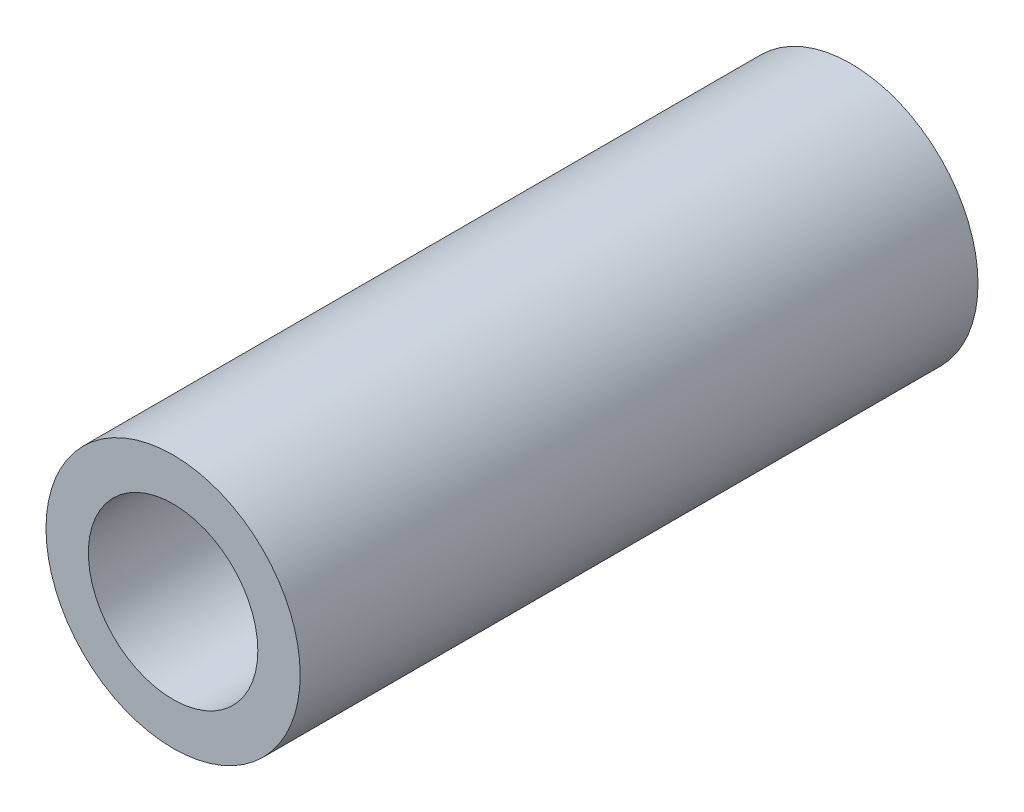
ISO-10303-21;
HEADER;
FILE_DESCRIPTION(('STEP AP214'),'2;1');
FILE_NAME('part.step','',(''),(''),'','','');
FILE_SCHEMA(('AUTOMOTIVE_DESIGN { 1 0 10303 214 1 1 1 1 }'));
ENDSEC;
DATA;
#1=APPLICATION_CONTEXT('core data for automotive mechanical design processes');
#2=APPLICATION_PROTOCOL_DEFINITION('international standard','automotive_design',2000,#1);
#3=PRODUCT_CONTEXT('',#1,'mechanical');
#4=PRODUCT('Part','Part','',(#3));
#5=PRODUCT_RELATED_PRODUCT_CATEGORY('part','',(#4));
#6=PRODUCT_DEFINITION_FORMATION('','',#4);
#7=PRODUCT_DEFINITION_CONTEXT('part definition',#1,'design');
#8=PRODUCT_DEFINITION('design','',#6,#7);
#9=PRODUCT_DEFINITION_SHAPE('','',#8);
#10=(LENGTH_UNIT() NAMED_UNIT(*) SI_UNIT(.MILLI.,.METRE.));
#11=(NAMED_UNIT(*) PLANE_ANGLE_UNIT() SI_UNIT($,.RADIAN.));
#12=(NAMED_UNIT(*) SI_UNIT($,.STERADIAN.) SOLID_ANGLE_UNIT());
#13=UNCERTAINTY_MEASURE_WITH_UNIT(LENGTH_MEASURE(1.E-05),#10,'distance_accuracy_value','');
#14=(GEOMETRIC_REPRESENTATION_CONTEXT(3) GLOBAL_UNCERTAINTY_ASSIGNED_CONTEXT((#13)) GLOBAL_UNIT_ASSIGNED_CONTEXT((#10,
#11,#12)) REPRESENTATION_CONTEXT('',''));
#15=CARTESIAN_POINT('',(0.,0.,0.));
#16=DIRECTION('',(0.,0.,1.));
#17=DIRECTION('',(1.,0.,0.));
#18=AXIS2_PLACEMENT_3D('',#15,#16,#17);
#19=CARTESIAN_POINT('',(0.,0.,40.));
#20=DIRECTION('',(0.,0.,-1.));
#21=DIRECTION('',(-1.,0.,0.));
#22=AXIS2_PLACEMENT_3D('',#19,#20,#21);
#23=CYLINDRICAL_SURFACE('',#22,7.5);
#24=CARTESIAN_POINT('',(0.,0.,40.));
#25=DIRECTION('',(0.,0.,1.));
#26=DIRECTION('',(1.,0.,0.));
#27=AXIS2_PLACEMENT_3D('',#24,#25,#26);
#28=CIRCLE('',#27,7.5);
#29=CARTESIAN_POINT('',(7.5,0.,40.));
#30=VERTEX_POINT('',#29);
#31=EDGE_CURVE('E10',#30,#30,#28,.T.);
#32=ORIENTED_EDGE('',*,*,#31,.F.);
#33=EDGE_LOOP('',(#32));
#34=FACE_BOUND('',#33,.T.);
#35=CARTESIAN_POINT('',(0.,0.,0.));
#36=DIRECTION('',(0.,0.,1.));
#37=DIRECTION('',(1.,0.,0.));
#38=AXIS2_PLACEMENT_3D('',#35,#36,#37);
#39=CIRCLE('',#38,7.5);
#40=CARTESIAN_POINT('',(7.5,0.,0.));
#41=VERTEX_POINT('',#40);
#42=EDGE_CURVE('E34',#41,#41,#39,.T.);
#43=ORIENTED_EDGE('',*,*,#42,.T.);
#44=EDGE_LOOP('',(#43));
#45=FACE_BOUND('',#44,.T.);
#46=ADVANCED_FACE('F31',(#34,#45),#23,.T.);
#47=CARTESIAN_POINT('',(0.,0.,40.));
#48=DIRECTION('',(0.,0.,1.));
#49=DIRECTION('',(1.,0.,0.));
#50=AXIS2_PLACEMENT_3D('',#47,#48,#49);
#51=PLANE('',#50);
#52=CARTESIAN_POINT('',(0.,0.,40.));
#53=DIRECTION('',(0.,0.,1.));
#54=DIRECTION('',(1.,0.,0.));
#55=AXIS2_PLACEMENT_3D('',#52,#53,#54);
#56=CIRCLE('',#55,5.);
#57=CARTESIAN_POINT('',(5.,0.,40.));
#58=VERTEX_POINT('',#57);
#59=EDGE_CURVE('E43',#58,#58,#56,.T.);
#60=ORIENTED_EDGE('',*,*,#59,.F.);
#61=EDGE_LOOP('',(#60));
#62=FACE_BOUND('',#61,.T.);
#63=ORIENTED_EDGE('',*,*,#31,.T.);
#64=EDGE_LOOP('',(#63));
#65=FACE_BOUND('',#64,.T.);
#66=ADVANCED_FACE('F68',(#62,#65),#51,.T.);
#67=CARTESIAN_POINT('',(0.,0.,0.));
#68=DIRECTION('',(0.,0.,1.));
#69=DIRECTION('',(1.,0.,0.));
#70=AXIS2_PLACEMENT_3D('',#67,#68,#69);
#71=PLANE('',#70);
#72=CARTESIAN_POINT('',(0.,0.,0.));
#73=DIRECTION('',(0.,0.,-1.));
#74=DIRECTION('',(-1.,0.,0.));
#75=AXIS2_PLACEMENT_3D('',#72,#73,#74);
#76=CIRCLE('',#75,5.);
#77=CARTESIAN_POINT('',(-5.,0.,0.));
#78=VERTEX_POINT('',#77);
#79=EDGE_CURVE('E49',#78,#78,#76,.T.);
#80=ORIENTED_EDGE('',*,*,#79,.F.);
#81=EDGE_LOOP('',(#80));
#82=FACE_BOUND('',#81,.T.);
#83=ORIENTED_EDGE('',*,*,#42,.F.);
#84=EDGE_LOOP('',(#83));
#85=FACE_BOUND('',#84,.T.);
#86=ADVANCED_FACE('F64',(#82,#85),#71,.F.);
#87=CARTESIAN_POINT('',(0.,0.,30.));
#88=DIRECTION('',(0.,0.,1.));
#89=DIRECTION('',(1.,0.,0.));
#90=AXIS2_PLACEMENT_3D('',#87,#88,#89);
#91=CYLINDRICAL_SURFACE('',#90,5.);
#92=CARTESIAN_POINT('',(0.,0.,30.));
#93=DIRECTION('',(0.,0.,1.));
#94=DIRECTION('',(1.,0.,0.));
#95=AXIS2_PLACEMENT_3D('',#92,#93,#94);
#96=CIRCLE('',#95,5.);
#97=CARTESIAN_POINT('',(5.,0.,30.));
#98=VERTEX_POINT('',#97);
#99=EDGE_CURVE('E41',#98,#98,#96,.T.);
#100=ORIENTED_EDGE('',*,*,#99,.F.);
#101=EDGE_LOOP('',(#100));
#102=FACE_BOUND('',#101,.T.);
#103=ORIENTED_EDGE('',*,*,#59,.T.);
#104=EDGE_LOOP('',(#103));
#105=FACE_BOUND('',#104,.T.);
#106=ADVANCED_FACE('F67',(#102,#105),#91,.F.);
#107=CARTESIAN_POINT('',(0.,0.,30.));
#108=DIRECTION('',(0.,0.,1.));
#109=DIRECTION('',(1.,0.,0.));
#110=AXIS2_PLACEMENT_3D('',#107,#108,#109);
#111=PLANE('',#110);
#112=ORIENTED_EDGE('',*,*,#99,.T.);
#113=EDGE_LOOP('',(#112));
#114=FACE_BOUND('',#113,.T.);
#115=ADVANCED_FACE('F60',(#114),#111,.T.);
#116=CARTESIAN_POINT('',(0.,0.,10.));
#117=DIRECTION('',(0.,0.,-1.));
#118=DIRECTION('',(-1.,0.,0.));
#119=AXIS2_PLACEMENT_3D('',#116,#117,#118);
#120=CYLINDRICAL_SURFACE('',#119,5.);
#121=CARTESIAN_POINT('',(0.,0.,10.));
#122=DIRECTION('',(0.,0.,-1.));
#123=DIRECTION('',(-1.,0.,0.));
#124=AXIS2_PLACEMENT_3D('',#121,#122,#123);
#125=CIRCLE('',#124,5.);
#126=CARTESIAN_POINT('',(-5.,0.,10.));
#127=VERTEX_POINT('',#126);
#128=EDGE_CURVE('E46',#127,#127,#125,.T.);
#129=ORIENTED_EDGE('',*,*,#128,.F.);
#130=EDGE_LOOP('',(#129));
#131=FACE_BOUND('',#130,.T.);
#132=ORIENTED_EDGE('',*,*,#79,.T.);
#133=EDGE_LOOP('',(#132));
#134=FACE_BOUND('',#133,.T.);
#135=ADVANCED_FACE('F57',(#131,#134),#120,.F.);
#136=CARTESIAN_POINT('',(0.,0.,10.));
#137=DIRECTION('',(0.,0.,-1.));
#138=DIRECTION('',(-1.,0.,0.));
#139=AXIS2_PLACEMENT_3D('',#136,#137,#138);
#140=PLANE('',#139);
#141=ORIENTED_EDGE('',*,*,#128,.T.);
#142=EDGE_LOOP('',(#141));
#143=FACE_BOUND('',#142,.T.);
#144=ADVANCED_FACE('F55',(#143),#140,.T.);
#145=CLOSED_SHELL('',(#46,#66,#86,#106,#115,#135,#144));
#146=MANIFOLD_SOLID_BREP('B2',#145);
#147=ADVANCED_BREP_SHAPE_REPRESENTATION('',(#18,#146),#14);
#148=SHAPE_DEFINITION_REPRESENTATION(#9,#147);
ENDSEC;
END-ISO-10303-21;
